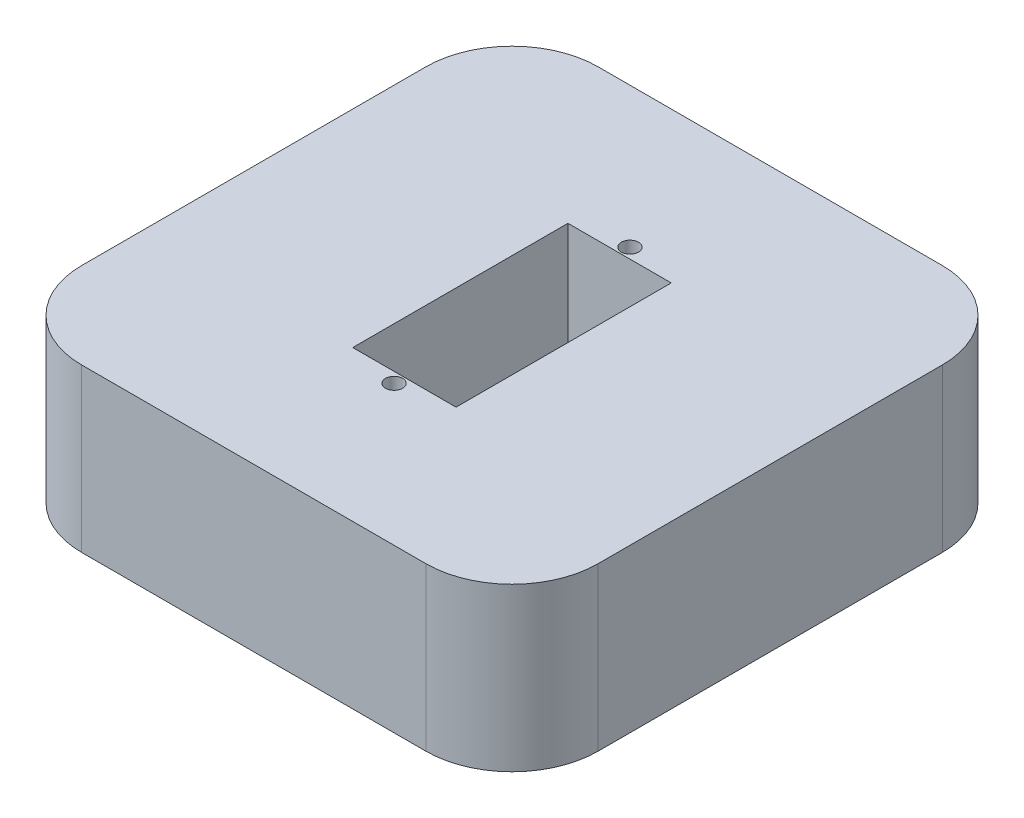
ISO-10303-21;
HEADER;
FILE_DESCRIPTION(('STEP AP214'),'2;1');
FILE_NAME('part.step','',(''),(''),'','','');
FILE_SCHEMA(('AUTOMOTIVE_DESIGN { 1 0 10303 214 1 1 1 1 }'));
ENDSEC;
DATA;
#1=APPLICATION_CONTEXT('core data for automotive mechanical design processes');
#2=APPLICATION_PROTOCOL_DEFINITION('international standard','automotive_design',2000,#1);
#3=PRODUCT_CONTEXT('',#1,'mechanical');
#4=PRODUCT('Part','Part','',(#3));
#5=PRODUCT_RELATED_PRODUCT_CATEGORY('part','',(#4));
#6=PRODUCT_DEFINITION_FORMATION('','',#4);
#7=PRODUCT_DEFINITION_CONTEXT('part definition',#1,'design');
#8=PRODUCT_DEFINITION('design','',#6,#7);
#9=PRODUCT_DEFINITION_SHAPE('','',#8);
#10=(LENGTH_UNIT() NAMED_UNIT(*) SI_UNIT(.MILLI.,.METRE.));
#11=(NAMED_UNIT(*) PLANE_ANGLE_UNIT() SI_UNIT($,.RADIAN.));
#12=(NAMED_UNIT(*) SI_UNIT($,.STERADIAN.) SOLID_ANGLE_UNIT());
#13=UNCERTAINTY_MEASURE_WITH_UNIT(LENGTH_MEASURE(1.E-05),#10,'distance_accuracy_value','');
#14=(GEOMETRIC_REPRESENTATION_CONTEXT(3) GLOBAL_UNCERTAINTY_ASSIGNED_CONTEXT((#13)) GLOBAL_UNIT_ASSIGNED_CONTEXT((#10,
#11,#12)) REPRESENTATION_CONTEXT('',''));
#15=CARTESIAN_POINT('',(0.,0.,0.));
#16=DIRECTION('',(0.,0.,1.));
#17=DIRECTION('',(1.,0.,0.));
#18=AXIS2_PLACEMENT_3D('',#15,#16,#17);
#19=CARTESIAN_POINT('',(0.,18.87,0.));
#20=DIRECTION('',(0.,-1.,0.));
#21=DIRECTION('',(0.,0.,-1.));
#22=AXIS2_PLACEMENT_3D('',#19,#20,#21);
#23=PLANE('',#22);
#24=CARTESIAN_POINT('',(0.,18.87,13.7));
#25=DIRECTION('',(0.,1.,0.));
#26=DIRECTION('',(0.,0.,1.));
#27=AXIS2_PLACEMENT_3D('',#24,#25,#26);
#28=CIRCLE('',#27,1.);
#29=CARTESIAN_POINT('',(0.,18.87,14.7));
#30=VERTEX_POINT('',#29);
#31=EDGE_CURVE('E393',#30,#30,#28,.T.);
#32=ORIENTED_EDGE('',*,*,#31,.F.);
#33=EDGE_LOOP('',(#32));
#34=FACE_BOUND('',#33,.T.);
#35=CARTESIAN_POINT('',(0.,18.87,-13.7));
#36=DIRECTION('',(0.,1.,0.));
#37=DIRECTION('',(0.,0.,1.));
#38=AXIS2_PLACEMENT_3D('',#35,#36,#37);
#39=CIRCLE('',#38,1.);
#40=CARTESIAN_POINT('',(0.,18.87,-12.7));
#41=VERTEX_POINT('',#40);
#42=EDGE_CURVE('E395',#41,#41,#39,.T.);
#43=ORIENTED_EDGE('',*,*,#42,.F.);
#44=EDGE_LOOP('',(#43));
#45=FACE_BOUND('',#44,.T.);
#46=DIRECTION('',(1.,0.,0.));
#47=VECTOR('',#46,1.);
#48=CARTESIAN_POINT('',(-30.,18.87,-30.));
#49=LINE('',#48,#47);
#50=CARTESIAN_POINT('',(-20.,18.87,-30.));
#51=VERTEX_POINT('',#50);
#52=CARTESIAN_POINT('',(20.,18.87,-30.));
#53=VERTEX_POINT('',#52);
#54=EDGE_CURVE('E161',#51,#53,#49,.T.);
#55=ORIENTED_EDGE('',*,*,#54,.F.);
#56=CARTESIAN_POINT('',(-20.,18.87,-20.));
#57=DIRECTION('',(0.,-1.,0.));
#58=DIRECTION('',(0.,0.,-1.));
#59=AXIS2_PLACEMENT_3D('',#56,#57,#58);
#60=CIRCLE('',#59,10.);
#61=CARTESIAN_POINT('',(-30.,18.87,-20.));
#62=VERTEX_POINT('',#61);
#63=EDGE_CURVE('E205',#51,#62,#60,.F.);
#64=ORIENTED_EDGE('',*,*,#63,.T.);
#65=DIRECTION('',(0.,0.,-1.));
#66=VECTOR('',#65,1.);
#67=CARTESIAN_POINT('',(-30.,18.87,30.));
#68=LINE('',#67,#66);
#69=CARTESIAN_POINT('',(-30.,18.87,20.));
#70=VERTEX_POINT('',#69);
#71=EDGE_CURVE('E158',#70,#62,#68,.T.);
#72=ORIENTED_EDGE('',*,*,#71,.F.);
#73=CARTESIAN_POINT('',(-20.,18.87,20.));
#74=DIRECTION('',(0.,-1.,0.));
#75=DIRECTION('',(0.,0.,-1.));
#76=AXIS2_PLACEMENT_3D('',#73,#74,#75);
#77=CIRCLE('',#76,10.);
#78=CARTESIAN_POINT('',(-20.,18.87,30.));
#79=VERTEX_POINT('',#78);
#80=EDGE_CURVE('E199',#70,#79,#77,.F.);
#81=ORIENTED_EDGE('',*,*,#80,.T.);
#82=DIRECTION('',(1.,0.,0.));
#83=VECTOR('',#82,1.);
#84=CARTESIAN_POINT('',(-30.,18.87,30.));
#85=LINE('',#84,#83);
#86=CARTESIAN_POINT('',(20.,18.87,30.));
#87=VERTEX_POINT('',#86);
#88=EDGE_CURVE('E168',#79,#87,#85,.T.);
#89=ORIENTED_EDGE('',*,*,#88,.T.);
#90=CARTESIAN_POINT('',(20.,18.87,20.));
#91=DIRECTION('',(0.,-1.,0.));
#92=DIRECTION('',(0.,0.,-1.));
#93=AXIS2_PLACEMENT_3D('',#90,#91,#92);
#94=CIRCLE('',#93,10.);
#95=CARTESIAN_POINT('',(30.,18.87,20.));
#96=VERTEX_POINT('',#95);
#97=EDGE_CURVE('E201',#87,#96,#94,.F.);
#98=ORIENTED_EDGE('',*,*,#97,.T.);
#99=DIRECTION('',(0.,0.,-1.));
#100=VECTOR('',#99,1.);
#101=CARTESIAN_POINT('',(30.,18.87,30.));
#102=LINE('',#101,#100);
#103=CARTESIAN_POINT('',(30.,18.87,-20.));
#104=VERTEX_POINT('',#103);
#105=EDGE_CURVE('E165',#96,#104,#102,.T.);
#106=ORIENTED_EDGE('',*,*,#105,.T.);
#107=CARTESIAN_POINT('',(20.,18.87,-20.));
#108=DIRECTION('',(0.,-1.,0.));
#109=DIRECTION('',(0.,0.,-1.));
#110=AXIS2_PLACEMENT_3D('',#107,#108,#109);
#111=CIRCLE('',#110,10.);
#112=EDGE_CURVE('E203',#104,#53,#111,.F.);
#113=ORIENTED_EDGE('',*,*,#112,.T.);
#114=EDGE_LOOP('',(#55,#64,#72,#81,#89,#98,#106,#113));
#115=FACE_BOUND('',#114,.T.);
#116=DIRECTION('',(0.,0.,-1.));
#117=VECTOR('',#116,1.);
#118=CARTESIAN_POINT('',(6.,18.87,12.5));
#119=LINE('',#118,#117);
#120=CARTESIAN_POINT('',(6.,18.87,12.5));
#121=VERTEX_POINT('',#120);
#122=CARTESIAN_POINT('',(6.,18.87,-12.5));
#123=VERTEX_POINT('',#122);
#124=EDGE_CURVE('E121',#121,#123,#119,.T.);
#125=ORIENTED_EDGE('',*,*,#124,.F.);
#126=DIRECTION('',(-1.,0.,0.));
#127=VECTOR('',#126,1.);
#128=CARTESIAN_POINT('',(6.,18.87,12.5));
#129=LINE('',#128,#127);
#130=CARTESIAN_POINT('',(-6.,18.87,12.5));
#131=VERTEX_POINT('',#130);
#132=EDGE_CURVE('E141',#121,#131,#129,.T.);
#133=ORIENTED_EDGE('',*,*,#132,.T.);
#134=DIRECTION('',(0.,0.,-1.));
#135=VECTOR('',#134,1.);
#136=CARTESIAN_POINT('',(-6.,18.87,12.5));
#137=LINE('',#136,#135);
#138=CARTESIAN_POINT('',(-6.,18.87,-12.5));
#139=VERTEX_POINT('',#138);
#140=EDGE_CURVE('E48',#131,#139,#137,.T.);
#141=ORIENTED_EDGE('',*,*,#140,.T.);
#142=DIRECTION('',(-1.,0.,0.));
#143=VECTOR('',#142,1.);
#144=CARTESIAN_POINT('',(6.,18.87,-12.5));
#145=LINE('',#144,#143);
#146=EDGE_CURVE('E130',#123,#139,#145,.T.);
#147=ORIENTED_EDGE('',*,*,#146,.F.);
#148=EDGE_LOOP('',(#125,#133,#141,#147));
#149=FACE_BOUND('',#148,.T.);
#150=ADVANCED_FACE('F33',(#34,#45,#115,#149),#23,.F.);
#151=CARTESIAN_POINT('',(0.,0.,0.));
#152=DIRECTION('',(0.,-1.,0.));
#153=DIRECTION('',(0.,0.,-1.));
#154=AXIS2_PLACEMENT_3D('',#151,#152,#153);
#155=PLANE('',#154);
#156=CARTESIAN_POINT('',(0.,0.,13.7));
#157=DIRECTION('',(0.,1.,0.));
#158=DIRECTION('',(0.,0.,1.));
#159=AXIS2_PLACEMENT_3D('',#156,#157,#158);
#160=CIRCLE('',#159,1.);
#161=CARTESIAN_POINT('',(0.,0.,14.7));
#162=VERTEX_POINT('',#161);
#163=EDGE_CURVE('E391',#162,#162,#160,.T.);
#164=ORIENTED_EDGE('',*,*,#163,.T.);
#165=EDGE_LOOP('',(#164));
#166=FACE_BOUND('',#165,.T.);
#167=CARTESIAN_POINT('',(0.,0.,-13.7));
#168=DIRECTION('',(0.,1.,0.));
#169=DIRECTION('',(0.,0.,1.));
#170=AXIS2_PLACEMENT_3D('',#167,#168,#169);
#171=CIRCLE('',#170,1.);
#172=CARTESIAN_POINT('',(0.,0.,-12.7));
#173=VERTEX_POINT('',#172);
#174=EDGE_CURVE('E147',#173,#173,#171,.T.);
#175=ORIENTED_EDGE('',*,*,#174,.T.);
#176=EDGE_LOOP('',(#175));
#177=FACE_BOUND('',#176,.T.);
#178=DIRECTION('',(0.,0.,-1.));
#179=VECTOR('',#178,1.);
#180=CARTESIAN_POINT('',(-30.,0.,30.));
#181=LINE('',#180,#179);
#182=CARTESIAN_POINT('',(-30.,0.,20.));
#183=VERTEX_POINT('',#182);
#184=CARTESIAN_POINT('',(-30.,0.,-20.));
#185=VERTEX_POINT('',#184);
#186=EDGE_CURVE('E137',#183,#185,#181,.T.);
#187=ORIENTED_EDGE('',*,*,#186,.T.);
#188=CARTESIAN_POINT('',(-20.,0.,-20.));
#189=DIRECTION('',(0.,-1.,0.));
#190=DIRECTION('',(0.,0.,-1.));
#191=AXIS2_PLACEMENT_3D('',#188,#189,#190);
#192=CIRCLE('',#191,10.);
#193=CARTESIAN_POINT('',(-20.,0.,-30.));
#194=VERTEX_POINT('',#193);
#195=EDGE_CURVE('E192',#185,#194,#192,.T.);
#196=ORIENTED_EDGE('',*,*,#195,.T.);
#197=DIRECTION('',(1.,0.,0.));
#198=VECTOR('',#197,1.);
#199=CARTESIAN_POINT('',(-30.,0.,-30.));
#200=LINE('',#199,#198);
#201=CARTESIAN_POINT('',(20.,0.,-30.));
#202=VERTEX_POINT('',#201);
#203=EDGE_CURVE('E174',#194,#202,#200,.T.);
#204=ORIENTED_EDGE('',*,*,#203,.T.);
#205=CARTESIAN_POINT('',(20.,0.,-20.));
#206=DIRECTION('',(0.,-1.,0.));
#207=DIRECTION('',(0.,0.,-1.));
#208=AXIS2_PLACEMENT_3D('',#205,#206,#207);
#209=CIRCLE('',#208,10.);
#210=CARTESIAN_POINT('',(30.,0.,-20.));
#211=VERTEX_POINT('',#210);
#212=EDGE_CURVE('E190',#202,#211,#209,.T.);
#213=ORIENTED_EDGE('',*,*,#212,.T.);
#214=DIRECTION('',(0.,0.,-1.));
#215=VECTOR('',#214,1.);
#216=CARTESIAN_POINT('',(30.,0.,30.));
#217=LINE('',#216,#215);
#218=CARTESIAN_POINT('',(30.,0.,20.));
#219=VERTEX_POINT('',#218);
#220=EDGE_CURVE('E177',#219,#211,#217,.T.);
#221=ORIENTED_EDGE('',*,*,#220,.F.);
#222=CARTESIAN_POINT('',(20.,0.,20.));
#223=DIRECTION('',(0.,-1.,0.));
#224=DIRECTION('',(0.,0.,-1.));
#225=AXIS2_PLACEMENT_3D('',#222,#223,#224);
#226=CIRCLE('',#225,10.);
#227=CARTESIAN_POINT('',(20.,0.,30.));
#228=VERTEX_POINT('',#227);
#229=EDGE_CURVE('E188',#219,#228,#226,.T.);
#230=ORIENTED_EDGE('',*,*,#229,.T.);
#231=DIRECTION('',(1.,0.,0.));
#232=VECTOR('',#231,1.);
#233=CARTESIAN_POINT('',(-30.,0.,30.));
#234=LINE('',#233,#232);
#235=CARTESIAN_POINT('',(-20.,0.,30.));
#236=VERTEX_POINT('',#235);
#237=EDGE_CURVE('E162',#236,#228,#234,.T.);
#238=ORIENTED_EDGE('',*,*,#237,.F.);
#239=CARTESIAN_POINT('',(-20.,0.,20.));
#240=DIRECTION('',(0.,-1.,0.));
#241=DIRECTION('',(0.,0.,-1.));
#242=AXIS2_PLACEMENT_3D('',#239,#240,#241);
#243=CIRCLE('',#242,10.);
#244=EDGE_CURVE('E186',#236,#183,#243,.T.);
#245=ORIENTED_EDGE('',*,*,#244,.T.);
#246=EDGE_LOOP('',(#187,#196,#204,#213,#221,#230,#238,#245));
#247=FACE_BOUND('',#246,.T.);
#248=DIRECTION('',(-1.,0.,0.));
#249=VECTOR('',#248,1.);
#250=CARTESIAN_POINT('',(6.,0.,12.5));
#251=LINE('',#250,#249);
#252=CARTESIAN_POINT('',(6.,0.,12.5));
#253=VERTEX_POINT('',#252);
#254=CARTESIAN_POINT('',(-6.,0.,12.5));
#255=VERTEX_POINT('',#254);
#256=EDGE_CURVE('E131',#253,#255,#251,.T.);
#257=ORIENTED_EDGE('',*,*,#256,.F.);
#258=DIRECTION('',(0.,0.,-1.));
#259=VECTOR('',#258,1.);
#260=CARTESIAN_POINT('',(6.,0.,12.5));
#261=LINE('',#260,#259);
#262=CARTESIAN_POINT('',(6.,0.,-12.5));
#263=VERTEX_POINT('',#262);
#264=EDGE_CURVE('E56',#253,#263,#261,.T.);
#265=ORIENTED_EDGE('',*,*,#264,.T.);
#266=DIRECTION('',(-1.,0.,0.));
#267=VECTOR('',#266,1.);
#268=CARTESIAN_POINT('',(6.,0.,-12.5));
#269=LINE('',#268,#267);
#270=CARTESIAN_POINT('',(-6.,0.,-12.5));
#271=VERTEX_POINT('',#270);
#272=EDGE_CURVE('E136',#263,#271,#269,.T.);
#273=ORIENTED_EDGE('',*,*,#272,.T.);
#274=DIRECTION('',(0.,0.,-1.));
#275=VECTOR('',#274,1.);
#276=CARTESIAN_POINT('',(-6.,0.,12.5));
#277=LINE('',#276,#275);
#278=EDGE_CURVE('E149',#255,#271,#277,.T.);
#279=ORIENTED_EDGE('',*,*,#278,.F.);
#280=EDGE_LOOP('',(#257,#265,#273,#279));
#281=FACE_BOUND('',#280,.T.);
#282=ADVANCED_FACE('F221',(#166,#177,#247,#281),#155,.T.);
#283=CARTESIAN_POINT('',(-30.,18.87,30.));
#284=DIRECTION('',(-1.,0.,0.));
#285=DIRECTION('',(0.,0.,1.));
#286=AXIS2_PLACEMENT_3D('',#283,#284,#285);
#287=PLANE('',#286);
#288=ORIENTED_EDGE('',*,*,#71,.T.);
#289=DIRECTION('',(0.,-1.,0.));
#290=VECTOR('',#289,1.);
#291=CARTESIAN_POINT('',(-30.,18.87,-20.));
#292=LINE('',#291,#290);
#293=EDGE_CURVE('E183',#62,#185,#292,.T.);
#294=ORIENTED_EDGE('',*,*,#293,.T.);
#295=ORIENTED_EDGE('',*,*,#186,.F.);
#296=DIRECTION('',(0.,-1.,0.));
#297=VECTOR('',#296,1.);
#298=CARTESIAN_POINT('',(-30.,18.87,20.));
#299=LINE('',#298,#297);
#300=EDGE_CURVE('E171',#183,#70,#299,.F.);
#301=ORIENTED_EDGE('',*,*,#300,.T.);
#302=EDGE_LOOP('',(#288,#294,#295,#301));
#303=FACE_BOUND('',#302,.T.);
#304=ADVANCED_FACE('F248',(#303),#287,.T.);
#305=CARTESIAN_POINT('',(-30.,18.87,30.));
#306=DIRECTION('',(0.,0.,-1.));
#307=DIRECTION('',(-1.,0.,0.));
#308=AXIS2_PLACEMENT_3D('',#305,#306,#307);
#309=PLANE('',#308);
#310=ORIENTED_EDGE('',*,*,#237,.T.);
#311=DIRECTION('',(0.,-1.,0.));
#312=VECTOR('',#311,1.);
#313=CARTESIAN_POINT('',(20.,18.87,30.));
#314=LINE('',#313,#312);
#315=EDGE_CURVE('E11',#228,#87,#314,.F.);
#316=ORIENTED_EDGE('',*,*,#315,.T.);
#317=ORIENTED_EDGE('',*,*,#88,.F.);
#318=DIRECTION('',(0.,-1.,0.));
#319=VECTOR('',#318,1.);
#320=CARTESIAN_POINT('',(-20.,0.,30.));
#321=LINE('',#320,#319);
#322=EDGE_CURVE('E41',#79,#236,#321,.T.);
#323=ORIENTED_EDGE('',*,*,#322,.T.);
#324=EDGE_LOOP('',(#310,#316,#317,#323));
#325=FACE_BOUND('',#324,.T.);
#326=ADVANCED_FACE('F216',(#325),#309,.F.);
#327=CARTESIAN_POINT('',(30.,18.87,30.));
#328=DIRECTION('',(-1.,0.,0.));
#329=DIRECTION('',(0.,0.,1.));
#330=AXIS2_PLACEMENT_3D('',#327,#328,#329);
#331=PLANE('',#330);
#332=ORIENTED_EDGE('',*,*,#220,.T.);
#333=DIRECTION('',(0.,-1.,0.));
#334=VECTOR('',#333,1.);
#335=CARTESIAN_POINT('',(30.,18.87,-20.));
#336=LINE('',#335,#334);
#337=EDGE_CURVE('E210',#211,#104,#336,.F.);
#338=ORIENTED_EDGE('',*,*,#337,.T.);
#339=ORIENTED_EDGE('',*,*,#105,.F.);
#340=DIRECTION('',(0.,-1.,0.));
#341=VECTOR('',#340,1.);
#342=CARTESIAN_POINT('',(30.,18.87,20.));
#343=LINE('',#342,#341);
#344=EDGE_CURVE('E207',#96,#219,#343,.T.);
#345=ORIENTED_EDGE('',*,*,#344,.T.);
#346=EDGE_LOOP('',(#332,#338,#339,#345));
#347=FACE_BOUND('',#346,.T.);
#348=ADVANCED_FACE('F231',(#347),#331,.F.);
#349=CARTESIAN_POINT('',(-30.,18.87,-30.));
#350=DIRECTION('',(0.,0.,-1.));
#351=DIRECTION('',(-1.,0.,0.));
#352=AXIS2_PLACEMENT_3D('',#349,#350,#351);
#353=PLANE('',#352);
#354=ORIENTED_EDGE('',*,*,#203,.F.);
#355=DIRECTION('',(0.,-1.,0.));
#356=VECTOR('',#355,1.);
#357=CARTESIAN_POINT('',(-20.,18.87,-30.));
#358=LINE('',#357,#356);
#359=EDGE_CURVE('E197',#194,#51,#358,.F.);
#360=ORIENTED_EDGE('',*,*,#359,.T.);
#361=ORIENTED_EDGE('',*,*,#54,.T.);
#362=DIRECTION('',(0.,-1.,0.));
#363=VECTOR('',#362,1.);
#364=CARTESIAN_POINT('',(20.,0.,-30.));
#365=LINE('',#364,#363);
#366=EDGE_CURVE('E194',#53,#202,#365,.T.);
#367=ORIENTED_EDGE('',*,*,#366,.T.);
#368=EDGE_LOOP('',(#354,#360,#361,#367));
#369=FACE_BOUND('',#368,.T.);
#370=ADVANCED_FACE('F241',(#369),#353,.T.);
#371=CARTESIAN_POINT('',(-20.,18.87,-20.));
#372=DIRECTION('',(0.,-1.,0.));
#373=DIRECTION('',(0.,0.,-1.));
#374=AXIS2_PLACEMENT_3D('',#371,#372,#373);
#375=CYLINDRICAL_SURFACE('',#374,10.);
#376=ORIENTED_EDGE('',*,*,#63,.F.);
#377=ORIENTED_EDGE('',*,*,#359,.F.);
#378=ORIENTED_EDGE('',*,*,#195,.F.);
#379=ORIENTED_EDGE('',*,*,#293,.F.);
#380=EDGE_LOOP('',(#376,#377,#378,#379));
#381=FACE_BOUND('',#380,.T.);
#382=ADVANCED_FACE('F246',(#381),#375,.T.);
#383=CARTESIAN_POINT('',(20.,18.87,-20.));
#384=DIRECTION('',(0.,1.,0.));
#385=DIRECTION('',(0.,0.,1.));
#386=AXIS2_PLACEMENT_3D('',#383,#384,#385);
#387=CYLINDRICAL_SURFACE('',#386,10.);
#388=ORIENTED_EDGE('',*,*,#112,.F.);
#389=ORIENTED_EDGE('',*,*,#337,.F.);
#390=ORIENTED_EDGE('',*,*,#212,.F.);
#391=ORIENTED_EDGE('',*,*,#366,.F.);
#392=EDGE_LOOP('',(#388,#389,#390,#391));
#393=FACE_BOUND('',#392,.T.);
#394=ADVANCED_FACE('F238',(#393),#387,.T.);
#395=CARTESIAN_POINT('',(20.,18.87,20.));
#396=DIRECTION('',(0.,-1.,0.));
#397=DIRECTION('',(0.,0.,-1.));
#398=AXIS2_PLACEMENT_3D('',#395,#396,#397);
#399=CYLINDRICAL_SURFACE('',#398,10.);
#400=ORIENTED_EDGE('',*,*,#97,.F.);
#401=ORIENTED_EDGE('',*,*,#315,.F.);
#402=ORIENTED_EDGE('',*,*,#229,.F.);
#403=ORIENTED_EDGE('',*,*,#344,.F.);
#404=EDGE_LOOP('',(#400,#401,#402,#403));
#405=FACE_BOUND('',#404,.T.);
#406=ADVANCED_FACE('F228',(#405),#399,.T.);
#407=CARTESIAN_POINT('',(-20.,18.87,20.));
#408=DIRECTION('',(0.,1.,0.));
#409=DIRECTION('',(0.,0.,1.));
#410=AXIS2_PLACEMENT_3D('',#407,#408,#409);
#411=CYLINDRICAL_SURFACE('',#410,10.);
#412=ORIENTED_EDGE('',*,*,#80,.F.);
#413=ORIENTED_EDGE('',*,*,#300,.F.);
#414=ORIENTED_EDGE('',*,*,#244,.F.);
#415=ORIENTED_EDGE('',*,*,#322,.F.);
#416=EDGE_LOOP('',(#412,#413,#414,#415));
#417=FACE_BOUND('',#416,.T.);
#418=ADVANCED_FACE('F35',(#417),#411,.T.);
#419=CARTESIAN_POINT('',(6.,18.87,12.5));
#420=DIRECTION('',(-1.,0.,0.));
#421=DIRECTION('',(0.,0.,1.));
#422=AXIS2_PLACEMENT_3D('',#419,#420,#421);
#423=PLANE('',#422);
#424=ORIENTED_EDGE('',*,*,#264,.F.);
#425=DIRECTION('',(0.,-1.,0.));
#426=VECTOR('',#425,1.);
#427=CARTESIAN_POINT('',(6.,18.87,12.5));
#428=LINE('',#427,#426);
#429=EDGE_CURVE('E125',#121,#253,#428,.T.);
#430=ORIENTED_EDGE('',*,*,#429,.F.);
#431=ORIENTED_EDGE('',*,*,#124,.T.);
#432=DIRECTION('',(0.,-1.,0.));
#433=VECTOR('',#432,1.);
#434=CARTESIAN_POINT('',(6.,18.87,-12.5));
#435=LINE('',#434,#433);
#436=EDGE_CURVE('E124',#123,#263,#435,.T.);
#437=ORIENTED_EDGE('',*,*,#436,.T.);
#438=EDGE_LOOP('',(#424,#430,#431,#437));
#439=FACE_BOUND('',#438,.T.);
#440=ADVANCED_FACE('F123',(#439),#423,.T.);
#441=CARTESIAN_POINT('',(6.,18.87,-12.5));
#442=DIRECTION('',(0.,0.,1.));
#443=DIRECTION('',(1.,0.,0.));
#444=AXIS2_PLACEMENT_3D('',#441,#442,#443);
#445=PLANE('',#444);
#446=ORIENTED_EDGE('',*,*,#272,.F.);
#447=ORIENTED_EDGE('',*,*,#436,.F.);
#448=ORIENTED_EDGE('',*,*,#146,.T.);
#449=DIRECTION('',(0.,-1.,0.));
#450=VECTOR('',#449,1.);
#451=CARTESIAN_POINT('',(-6.,18.87,-12.5));
#452=LINE('',#451,#450);
#453=EDGE_CURVE('E138',#139,#271,#452,.T.);
#454=ORIENTED_EDGE('',*,*,#453,.T.);
#455=EDGE_LOOP('',(#446,#447,#448,#454));
#456=FACE_BOUND('',#455,.T.);
#457=ADVANCED_FACE('F134',(#456),#445,.T.);
#458=CARTESIAN_POINT('',(-6.,18.87,12.5));
#459=DIRECTION('',(-1.,0.,0.));
#460=DIRECTION('',(0.,0.,1.));
#461=AXIS2_PLACEMENT_3D('',#458,#459,#460);
#462=PLANE('',#461);
#463=ORIENTED_EDGE('',*,*,#278,.T.);
#464=ORIENTED_EDGE('',*,*,#453,.F.);
#465=ORIENTED_EDGE('',*,*,#140,.F.);
#466=DIRECTION('',(0.,-1.,0.));
#467=VECTOR('',#466,1.);
#468=CARTESIAN_POINT('',(-6.,18.87,12.5));
#469=LINE('',#468,#467);
#470=EDGE_CURVE('E155',#131,#255,#469,.T.);
#471=ORIENTED_EDGE('',*,*,#470,.T.);
#472=EDGE_LOOP('',(#463,#464,#465,#471));
#473=FACE_BOUND('',#472,.T.);
#474=ADVANCED_FACE('F310',(#473),#462,.F.);
#475=CARTESIAN_POINT('',(6.,18.87,12.5));
#476=DIRECTION('',(0.,0.,1.));
#477=DIRECTION('',(1.,0.,0.));
#478=AXIS2_PLACEMENT_3D('',#475,#476,#477);
#479=PLANE('',#478);
#480=ORIENTED_EDGE('',*,*,#256,.T.);
#481=ORIENTED_EDGE('',*,*,#470,.F.);
#482=ORIENTED_EDGE('',*,*,#132,.F.);
#483=ORIENTED_EDGE('',*,*,#429,.T.);
#484=EDGE_LOOP('',(#480,#481,#482,#483));
#485=FACE_BOUND('',#484,.T.);
#486=ADVANCED_FACE('F318',(#485),#479,.F.);
#487=CARTESIAN_POINT('',(0.,0.,-13.7));
#488=DIRECTION('',(0.,1.,0.));
#489=DIRECTION('',(0.,0.,1.));
#490=AXIS2_PLACEMENT_3D('',#487,#488,#489);
#491=CYLINDRICAL_SURFACE('',#490,1.);
#492=ORIENTED_EDGE('',*,*,#174,.F.);
#493=EDGE_LOOP('',(#492));
#494=FACE_BOUND('',#493,.T.);
#495=ORIENTED_EDGE('',*,*,#42,.T.);
#496=EDGE_LOOP('',(#495));
#497=FACE_BOUND('',#496,.T.);
#498=ADVANCED_FACE('F326',(#494,#497),#491,.F.);
#499=CARTESIAN_POINT('',(0.,0.,13.7));
#500=DIRECTION('',(0.,1.,0.));
#501=DIRECTION('',(0.,0.,1.));
#502=AXIS2_PLACEMENT_3D('',#499,#500,#501);
#503=CYLINDRICAL_SURFACE('',#502,1.);
#504=ORIENTED_EDGE('',*,*,#163,.F.);
#505=EDGE_LOOP('',(#504));
#506=FACE_BOUND('',#505,.T.);
#507=ORIENTED_EDGE('',*,*,#31,.T.);
#508=EDGE_LOOP('',(#507));
#509=FACE_BOUND('',#508,.T.);
#510=ADVANCED_FACE('F335',(#506,#509),#503,.F.);
#511=CLOSED_SHELL('',(#150,#282,#304,#326,#348,#370,#382,#394,#406,#418,#440,#457,#474,#486,
#498,#510));
#512=MANIFOLD_SOLID_BREP('B2',#511);
#513=ADVANCED_BREP_SHAPE_REPRESENTATION('',(#18,#512),#14);
#514=SHAPE_DEFINITION_REPRESENTATION(#9,#513);
ENDSEC;
END-ISO-10303-21;
